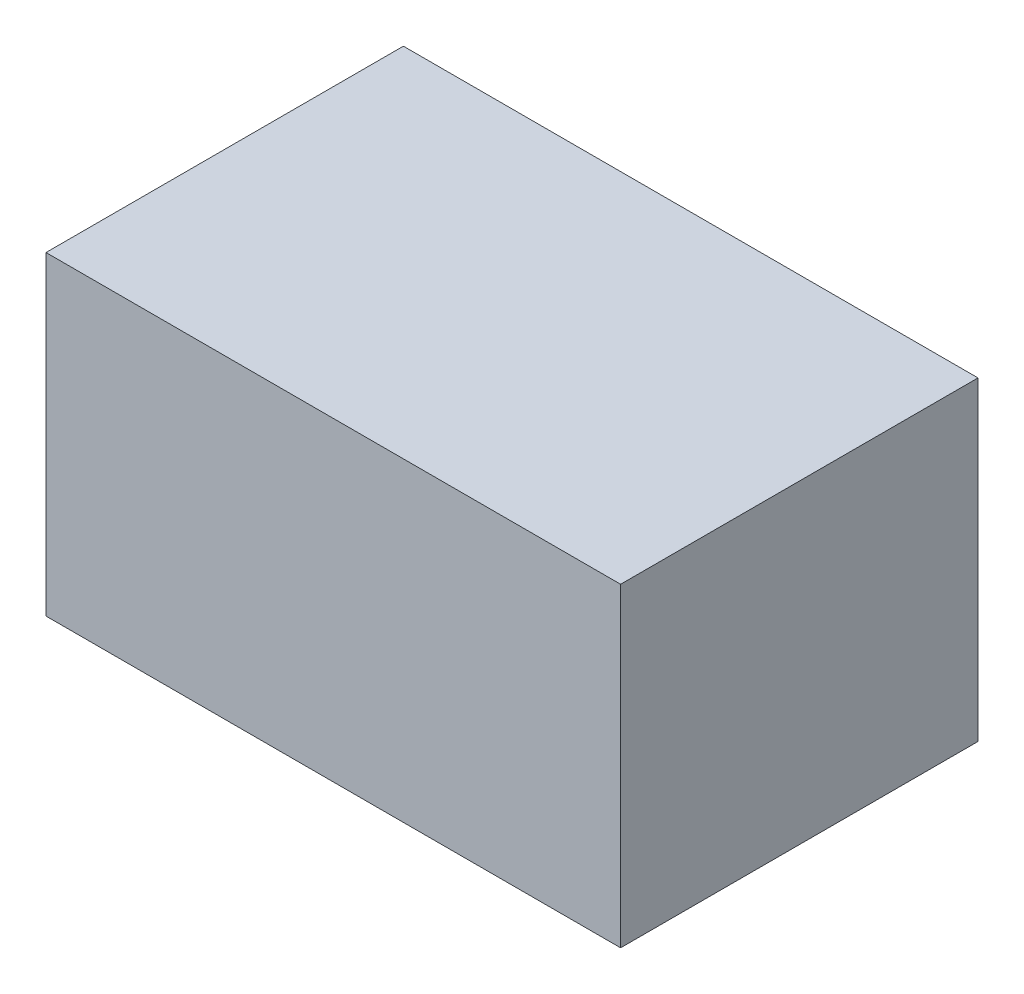
ISO-10303-21;
HEADER;
FILE_DESCRIPTION(('STEP AP214'),'2;1');
FILE_NAME('part.step','',(''),(''),'','','');
FILE_SCHEMA(('AUTOMOTIVE_DESIGN { 1 0 10303 214 1 1 1 1 }'));
ENDSEC;
DATA;
#1=APPLICATION_CONTEXT('core data for automotive mechanical design processes');
#2=APPLICATION_PROTOCOL_DEFINITION('international standard','automotive_design',2000,#1);
#3=PRODUCT_CONTEXT('',#1,'mechanical');
#4=PRODUCT('Part','Part','',(#3));
#5=PRODUCT_RELATED_PRODUCT_CATEGORY('part','',(#4));
#6=PRODUCT_DEFINITION_FORMATION('','',#4);
#7=PRODUCT_DEFINITION_CONTEXT('part definition',#1,'design');
#8=PRODUCT_DEFINITION('design','',#6,#7);
#9=PRODUCT_DEFINITION_SHAPE('','',#8);
#10=(LENGTH_UNIT() NAMED_UNIT(*) SI_UNIT(.MILLI.,.METRE.));
#11=(NAMED_UNIT(*) PLANE_ANGLE_UNIT() SI_UNIT($,.RADIAN.));
#12=(NAMED_UNIT(*) SI_UNIT($,.STERADIAN.) SOLID_ANGLE_UNIT());
#13=UNCERTAINTY_MEASURE_WITH_UNIT(LENGTH_MEASURE(1.E-05),#10,'distance_accuracy_value','');
#14=(GEOMETRIC_REPRESENTATION_CONTEXT(3) GLOBAL_UNCERTAINTY_ASSIGNED_CONTEXT((#13)) GLOBAL_UNIT_ASSIGNED_CONTEXT((#10,
#11,#12)) REPRESENTATION_CONTEXT('',''));
#15=CARTESIAN_POINT('',(0.,0.,0.));
#16=DIRECTION('',(0.,0.,1.));
#17=DIRECTION('',(1.,0.,0.));
#18=AXIS2_PLACEMENT_3D('',#15,#16,#17);
#19=CARTESIAN_POINT('',(-20.0525,15.5175,9.8645));
#20=DIRECTION('',(1.,0.,0.));
#21=DIRECTION('',(0.,0.,-1.));
#22=AXIS2_PLACEMENT_3D('',#19,#20,#21);
#23=PLANE('',#22);
#24=DIRECTION('',(0.,-1.,0.));
#25=VECTOR('',#24,1.);
#26=CARTESIAN_POINT('',(-20.0525,15.5175,-9.8645));
#27=LINE('',#26,#25);
#28=CARTESIAN_POINT('',(-20.0525,15.5175,-9.8645));
#29=VERTEX_POINT('',#28);
#30=CARTESIAN_POINT('',(-20.0525,-1.8635,-9.8645));
#31=VERTEX_POINT('',#30);
#32=EDGE_CURVE('E101',#29,#31,#27,.T.);
#33=ORIENTED_EDGE('',*,*,#32,.T.);
#34=DIRECTION('',(0.,0.,-1.));
#35=VECTOR('',#34,1.);
#36=CARTESIAN_POINT('',(-20.0525,-1.8635,9.8645));
#37=LINE('',#36,#35);
#38=CARTESIAN_POINT('',(-20.0525,-1.8635,9.8645));
#39=VERTEX_POINT('',#38);
#40=EDGE_CURVE('E11',#39,#31,#37,.T.);
#41=ORIENTED_EDGE('',*,*,#40,.F.);
#42=DIRECTION('',(0.,-1.,0.));
#43=VECTOR('',#42,1.);
#44=CARTESIAN_POINT('',(-20.0525,15.5175,9.8645));
#45=LINE('',#44,#43);
#46=CARTESIAN_POINT('',(-20.0525,15.5175,9.8645));
#47=VERTEX_POINT('',#46);
#48=EDGE_CURVE('E95',#47,#39,#45,.T.);
#49=ORIENTED_EDGE('',*,*,#48,.F.);
#50=DIRECTION('',(0.,0.,-1.));
#51=VECTOR('',#50,1.);
#52=CARTESIAN_POINT('',(-20.0525,15.5175,9.8645));
#53=LINE('',#52,#51);
#54=EDGE_CURVE('E99',#47,#29,#53,.T.);
#55=ORIENTED_EDGE('',*,*,#54,.T.);
#56=EDGE_LOOP('',(#33,#41,#49,#55));
#57=FACE_BOUND('',#56,.T.);
#58=ADVANCED_FACE('F41',(#57),#23,.F.);
#59=CARTESIAN_POINT('',(-20.0525,-1.8635,9.8645));
#60=DIRECTION('',(0.,1.,0.));
#61=DIRECTION('',(0.,0.,1.));
#62=AXIS2_PLACEMENT_3D('',#59,#60,#61);
#63=PLANE('',#62);
#64=DIRECTION('',(1.,0.,0.));
#65=VECTOR('',#64,1.);
#66=CARTESIAN_POINT('',(-20.0525,-1.8635,-9.8645));
#67=LINE('',#66,#65);
#68=CARTESIAN_POINT('',(11.6665,-1.8635,-9.8645));
#69=VERTEX_POINT('',#68);
#70=EDGE_CURVE('E96',#31,#69,#67,.T.);
#71=ORIENTED_EDGE('',*,*,#70,.T.);
#72=DIRECTION('',(0.,0.,-1.));
#73=VECTOR('',#72,1.);
#74=CARTESIAN_POINT('',(11.6665,-1.8635,9.8645));
#75=LINE('',#74,#73);
#76=CARTESIAN_POINT('',(11.6665,-1.8635,9.8645));
#77=VERTEX_POINT('',#76);
#78=EDGE_CURVE('E47',#77,#69,#75,.T.);
#79=ORIENTED_EDGE('',*,*,#78,.F.);
#80=DIRECTION('',(1.,0.,0.));
#81=VECTOR('',#80,1.);
#82=CARTESIAN_POINT('',(-20.0525,-1.8635,9.8645));
#83=LINE('',#82,#81);
#84=EDGE_CURVE('E90',#39,#77,#83,.T.);
#85=ORIENTED_EDGE('',*,*,#84,.F.);
#86=ORIENTED_EDGE('',*,*,#40,.T.);
#87=EDGE_LOOP('',(#71,#79,#85,#86));
#88=FACE_BOUND('',#87,.T.);
#89=ADVANCED_FACE('F94',(#88),#63,.F.);
#90=CARTESIAN_POINT('',(11.6665,-1.8635,9.8645));
#91=DIRECTION('',(-1.,0.,0.));
#92=DIRECTION('',(0.,0.,1.));
#93=AXIS2_PLACEMENT_3D('',#90,#91,#92);
#94=PLANE('',#93);
#95=DIRECTION('',(0.,1.,0.));
#96=VECTOR('',#95,1.);
#97=CARTESIAN_POINT('',(11.6665,-1.8635,-9.8645));
#98=LINE('',#97,#96);
#99=CARTESIAN_POINT('',(11.6665,15.5175,-9.8645));
#100=VERTEX_POINT('',#99);
#101=EDGE_CURVE('E71',#69,#100,#98,.T.);
#102=ORIENTED_EDGE('',*,*,#101,.T.);
#103=DIRECTION('',(0.,0.,-1.));
#104=VECTOR('',#103,1.);
#105=CARTESIAN_POINT('',(11.6665,15.5175,9.8645));
#106=LINE('',#105,#104);
#107=CARTESIAN_POINT('',(11.6665,15.5175,9.8645));
#108=VERTEX_POINT('',#107);
#109=EDGE_CURVE('E100',#108,#100,#106,.T.);
#110=ORIENTED_EDGE('',*,*,#109,.F.);
#111=DIRECTION('',(0.,1.,0.));
#112=VECTOR('',#111,1.);
#113=CARTESIAN_POINT('',(11.6665,-1.8635,9.8645));
#114=LINE('',#113,#112);
#115=EDGE_CURVE('E89',#77,#108,#114,.T.);
#116=ORIENTED_EDGE('',*,*,#115,.F.);
#117=ORIENTED_EDGE('',*,*,#78,.T.);
#118=EDGE_LOOP('',(#102,#110,#116,#117));
#119=FACE_BOUND('',#118,.T.);
#120=ADVANCED_FACE('F97',(#119),#94,.F.);
#121=CARTESIAN_POINT('',(11.6665,15.5175,9.8645));
#122=DIRECTION('',(0.,-1.,0.));
#123=DIRECTION('',(0.,0.,-1.));
#124=AXIS2_PLACEMENT_3D('',#121,#122,#123);
#125=PLANE('',#124);
#126=DIRECTION('',(-1.,0.,0.));
#127=VECTOR('',#126,1.);
#128=CARTESIAN_POINT('',(11.6665,15.5175,-9.8645));
#129=LINE('',#128,#127);
#130=EDGE_CURVE('E79',#100,#29,#129,.T.);
#131=ORIENTED_EDGE('',*,*,#130,.T.);
#132=ORIENTED_EDGE('',*,*,#54,.F.);
#133=DIRECTION('',(-1.,0.,0.));
#134=VECTOR('',#133,1.);
#135=CARTESIAN_POINT('',(11.6665,15.5175,9.8645));
#136=LINE('',#135,#134);
#137=EDGE_CURVE('E60',#108,#47,#136,.T.);
#138=ORIENTED_EDGE('',*,*,#137,.F.);
#139=ORIENTED_EDGE('',*,*,#109,.T.);
#140=EDGE_LOOP('',(#131,#132,#138,#139));
#141=FACE_BOUND('',#140,.T.);
#142=ADVANCED_FACE('F112',(#141),#125,.F.);
#143=CARTESIAN_POINT('',(0.,0.,9.8645));
#144=DIRECTION('',(0.,0.,1.));
#145=DIRECTION('',(1.,0.,0.));
#146=AXIS2_PLACEMENT_3D('',#143,#144,#145);
#147=PLANE('',#146);
#148=ORIENTED_EDGE('',*,*,#48,.T.);
#149=ORIENTED_EDGE('',*,*,#84,.T.);
#150=ORIENTED_EDGE('',*,*,#115,.T.);
#151=ORIENTED_EDGE('',*,*,#137,.T.);
#152=EDGE_LOOP('',(#148,#149,#150,#151));
#153=FACE_BOUND('',#152,.T.);
#154=ADVANCED_FACE('F88',(#153),#147,.T.);
#155=CARTESIAN_POINT('',(0.,0.,-9.8645));
#156=DIRECTION('',(0.,0.,1.));
#157=DIRECTION('',(1.,0.,0.));
#158=AXIS2_PLACEMENT_3D('',#155,#156,#157);
#159=PLANE('',#158);
#160=ORIENTED_EDGE('',*,*,#32,.F.);
#161=ORIENTED_EDGE('',*,*,#130,.F.);
#162=ORIENTED_EDGE('',*,*,#101,.F.);
#163=ORIENTED_EDGE('',*,*,#70,.F.);
#164=EDGE_LOOP('',(#160,#161,#162,#163));
#165=FACE_BOUND('',#164,.T.);
#166=ADVANCED_FACE('F114',(#165),#159,.F.);
#167=CLOSED_SHELL('',(#58,#89,#120,#142,#154,#166));
#168=MANIFOLD_SOLID_BREP('B2',#167);
#169=ADVANCED_BREP_SHAPE_REPRESENTATION('',(#18,#168),#14);
#170=SHAPE_DEFINITION_REPRESENTATION(#9,#169);
ENDSEC;
END-ISO-10303-21;
